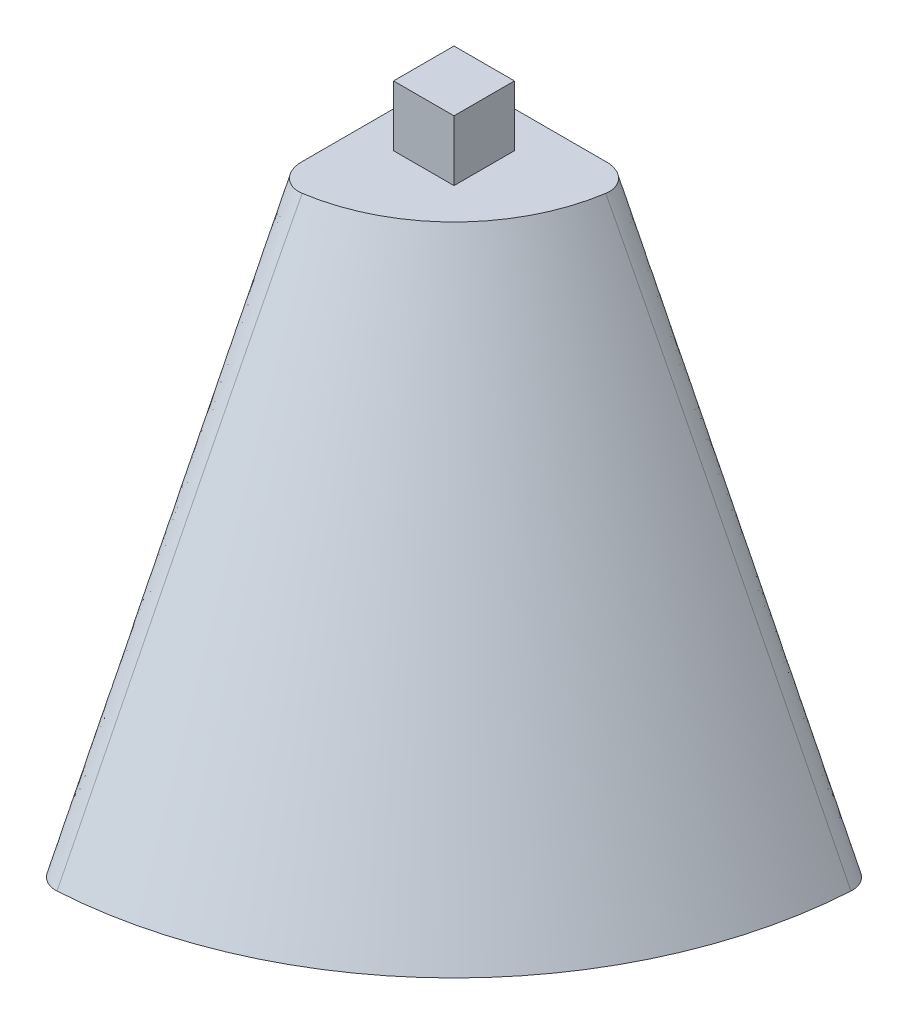
ISO-10303-21;
HEADER;
FILE_DESCRIPTION(('STEP AP214'),'2;1');
FILE_NAME('part.step','',(''),(''),'','','');
FILE_SCHEMA(('AUTOMOTIVE_DESIGN { 1 0 10303 214 1 1 1 1 }'));
ENDSEC;
DATA;
#1=APPLICATION_CONTEXT('core data for automotive mechanical design processes');
#2=APPLICATION_PROTOCOL_DEFINITION('international standard','automotive_design',2000,#1);
#3=PRODUCT_CONTEXT('',#1,'mechanical');
#4=PRODUCT('Part','Part','',(#3));
#5=PRODUCT_RELATED_PRODUCT_CATEGORY('part','',(#4));
#6=PRODUCT_DEFINITION_FORMATION('','',#4);
#7=PRODUCT_DEFINITION_CONTEXT('part definition',#1,'design');
#8=PRODUCT_DEFINITION('design','',#6,#7);
#9=PRODUCT_DEFINITION_SHAPE('','',#8);
#10=(LENGTH_UNIT() NAMED_UNIT(*) SI_UNIT(.MILLI.,.METRE.));
#11=(NAMED_UNIT(*) PLANE_ANGLE_UNIT() SI_UNIT($,.RADIAN.));
#12=(NAMED_UNIT(*) SI_UNIT($,.STERADIAN.) SOLID_ANGLE_UNIT());
#13=UNCERTAINTY_MEASURE_WITH_UNIT(LENGTH_MEASURE(1.E-05),#10,'distance_accuracy_value','');
#14=(GEOMETRIC_REPRESENTATION_CONTEXT(3) GLOBAL_UNCERTAINTY_ASSIGNED_CONTEXT((#13)) GLOBAL_UNIT_ASSIGNED_CONTEXT((#10,
#11,#12)) REPRESENTATION_CONTEXT('',''));
#15=CARTESIAN_POINT('',(0.,0.,0.));
#16=DIRECTION('',(0.,0.,1.));
#17=DIRECTION('',(1.,0.,0.));
#18=AXIS2_PLACEMENT_3D('',#15,#16,#17);
#19=CARTESIAN_POINT('',(0.,0.,0.));
#20=DIRECTION('',(0.,-1.,0.));
#21=DIRECTION('',(1.,0.,0.));
#22=AXIS2_PLACEMENT_3D('',#19,#20,#21);
#23=PLANE('',#22);
#24=DIRECTION('',(-1.,0.,0.));
#25=VECTOR('',#24,1.);
#26=CARTESIAN_POINT('',(0.,0.,0.));
#27=LINE('',#26,#25);
#28=CARTESIAN_POINT('',(12.6062667223491,0.,0.));
#29=VERTEX_POINT('',#28);
#30=CARTESIAN_POINT('',(2.99999999999999,0.,0.));
#31=VERTEX_POINT('',#30);
#32=EDGE_CURVE('E137',#29,#31,#27,.T.);
#33=ORIENTED_EDGE('',*,*,#32,.T.);
#34=CARTESIAN_POINT('',(2.99999999999999,0.,3.));
#35=DIRECTION('',(0.,-1.,0.));
#36=DIRECTION('',(1.,0.,0.));
#37=AXIS2_PLACEMENT_3D('',#34,#35,#36);
#38=CIRCLE('',#37,3.);
#39=CARTESIAN_POINT('',(0.,0.,2.99999999999999));
#40=VERTEX_POINT('',#39);
#41=EDGE_CURVE('E11',#31,#40,#38,.F.);
#42=ORIENTED_EDGE('',*,*,#41,.T.);
#43=DIRECTION('',(0.,0.,-1.));
#44=VECTOR('',#43,1.);
#45=CARTESIAN_POINT('',(0.,0.,0.));
#46=LINE('',#45,#44);
#47=CARTESIAN_POINT('',(0.,0.,12.6062667223491));
#48=VERTEX_POINT('',#47);
#49=EDGE_CURVE('E147',#48,#40,#46,.T.);
#50=ORIENTED_EDGE('',*,*,#49,.F.);
#51=CARTESIAN_POINT('',(2.09520745404908,-48.7337729551609,39.311090759011));
#52=CARTESIAN_POINT('',(-1.31838984174237E-13,-48.6890667030976,39.4003765364552));
#53=CARTESIAN_POINT('',(-1.2490009027033E-13,-49.6282001461608,37.5247717671472));
#54=CARTESIAN_POINT('',(2.09825591558037,-46.3417771603627,38.1132208088973));
#55=CARTESIAN_POINT('',(-1.27799781086608E-13,-46.2940221477129,38.2047315466528));
#56=CARTESIAN_POINT('',(-1.20993474101923E-13,-47.2362043513594,36.327065991603));
#57=CARTESIAN_POINT('',(2.10155900072438,-43.9498385284172,36.915218543094));
#58=CARTESIAN_POINT('',(-1.23962242701282E-13,-43.8997551119547,37.0096378323661));
#59=CARTESIAN_POINT('',(-1.17092090877627E-13,-44.8442657194151,35.1292460119136));
#60=CARTESIAN_POINT('',(2.10895550331378,-39.1661402113831,34.5187888362615));
#61=CARTESIAN_POINT('',(-1.1628947277766E-13,-39.1121766733257,34.6204434815684));
#62=CARTESIAN_POINT('',(-1.09289324426768E-13,-40.060567402384,32.7332513725554));
#63=CARTESIAN_POINT('',(2.11304892041693,-36.7743805262175,33.3203613954164));
#64=CARTESIAN_POINT('',(-1.12452619414258E-13,-36.7178523542753,33.4258383684079));
#65=CARTESIAN_POINT('',(-1.05387941200206E-13,-37.66880771722,31.5350767130405));
#66=CARTESIAN_POINT('',(2.12230716336211,-31.9911082277229,30.9229225520435));
#67=CARTESIAN_POINT('',(-1.04377895591329E-13,-31.9299143349147,31.0376939245209));
#68=CARTESIAN_POINT('',(0.,-32.8855354187203,29.1382481991043));
#69=CARTESIAN_POINT('',(2.12747198670636,-29.599595613831,29.7239111508834));
#70=CARTESIAN_POINT('',(-1.00136698595859E-13,-29.5349156454655,29.8434655363361));
#71=CARTESIAN_POINT('',(0.,-30.4940228048216,27.9395943458067));
#72=CARTESIAN_POINT('',(2.13936911123669,-24.8169234930147,27.3250067019271));
#73=CARTESIAN_POINT('',(0.,-24.74610791853,27.4566665490894));
#74=CARTESIAN_POINT('',(0.,-25.7113506840199,25.5415797061697));
#75=CARTESIAN_POINT('',(2.14610141312043,-22.4257639862481,26.1251136537386));
#76=CARTESIAN_POINT('',(0.,-22.3502499820417,26.2630781598969));
#77=CARTESIAN_POINT('',(0.,-23.3201911772746,24.3422189195158));
#78=CARTESIAN_POINT('',(2.16194227677236,-17.643973973532,23.7239472541923));
#79=CARTESIAN_POINT('',(0.,-17.5599563428948,23.8782696667915));
#80=CARTESIAN_POINT('',(0.,-18.5384011645053,21.9424193023201));
#81=CARTESIAN_POINT('',(2.17105084796585,-15.2533434697184,22.5226738973785));
#82=CARTESIAN_POINT('',(0.,-15.1623690938531,22.6854877539769));
#83=CARTESIAN_POINT('',(0.,-16.1477706606172,20.741980467521));
#84=CARTESIAN_POINT('',(2.18768322034261,-11.6680760449612,20.7189656325648));
#85=CARTESIAN_POINT('',(0.,-11.5736659745978,20.9022913868091));
#86=CARTESIAN_POINT('',(0.,-12.5625032359048,18.9399759064426));
#87=CARTESIAN_POINT('',(2.19372225946164,-10.4731006366861,20.1174301813409));
#88=CARTESIAN_POINT('',(0.,-10.3749742517414,20.3070349645445));
#89=CARTESIAN_POINT('',(0.,-11.3675278276708,18.3390836760893));
#90=CARTESIAN_POINT('',(2.20713507743186,-8.08345509614255,18.9135263384728));
#91=CARTESIAN_POINT('',(0.,-7.97787992133957,19.1176665028858));
#92=CARTESIAN_POINT('',(0.,-8.97788228715727,17.1366916394181));
#93=CARTESIAN_POINT('',(2.21450885662903,-6.88878496395324,18.3111579466127));
#94=CARTESIAN_POINT('',(0.,-6.77856156171675,18.5231038389545));
#95=CARTESIAN_POINT('',(0.,-7.78321215495696,16.5351918329428));
#96=CARTESIAN_POINT('',(2.23108093024212,-4.49985997475611,17.1052420397375));
#97=CARTESIAN_POINT('',(0.,-4.38023713478147,17.3355460835015));
#98=CARTESIAN_POINT('',(0.,-5.39428716575221,15.3313560801745));
#99=CARTESIAN_POINT('',(2.24027923199876,-3.30560511943847,16.501694519988));
#100=CARTESIAN_POINT('',(0.,-3.17995746875332,16.7419269810444));
#101=CARTESIAN_POINT('',(0.,-4.20003231043795,14.7290201305272));
#102=CARTESIAN_POINT('',(2.26125803845047,-0.917695092815208,15.2928684545352));
#103=CARTESIAN_POINT('',(0.,-0.779697479551548,15.556916481961));
#104=CARTESIAN_POINT('',(0.,-1.81212228379557,13.5231622368254));
#105=CARTESIAN_POINT('',(2.2730385413027,0.275960078917779,14.6875899100677));
#106=CARTESIAN_POINT('',(0.,0.422125340826944,14.9646279931276));
#107=CARTESIAN_POINT('',(0.,-0.618467112040083,12.9196402936177));
#108=CARTESIAN_POINT('',(2.29361221440765,2.06576380780487,13.7776179514834));
#109=CARTESIAN_POINT('',(0.,2.22083827894981,14.0806357624269));
#110=CARTESIAN_POINT('',(0.,1.17133661678393,12.0130107040506));
#111=CARTESIAN_POINT('',(2.30095394326552,2.66225310090716,13.4739509839486));
#112=CARTESIAN_POINT('',(0.,2.82207087808302,13.7855705439965));
#113=CARTESIAN_POINT('',(0.,1.76782590984905,11.7105757739588));
#114=CARTESIAN_POINT('',(2.3168592304806,3.85494217986451,12.865722545751));
#115=CARTESIAN_POINT('',(0.,4.0247165035559,13.1964284649654));
#116=CARTESIAN_POINT('',(0.,2.96051498892362,11.1051359394984));
#117=CARTESIAN_POINT('',(2.32542278849665,4.45114196580037,12.561161075338));
#118=CARTESIAN_POINT('',(0.,4.62658690170721,12.902132639026));
#119=CARTESIAN_POINT('',(0.,3.55671477501386,10.8021310352888));
#120=CARTESIAN_POINT('',(2.34408582081135,5.64317605041756,11.9508760271658));
#121=CARTESIAN_POINT('',(0.,5.83070728388637,12.3147589567844));
#122=CARTESIAN_POINT('',(0.,4.74874885965276,10.1953992432551));
#123=CARTESIAN_POINT('',(2.35418529883994,6.2390103482078,11.6451524465862));
#124=CARTESIAN_POINT('',(0.,6.43354518459165,12.0214022248107));
#125=CARTESIAN_POINT('',(0.,5.34458315731031,9.89167235367935));
#126=CARTESIAN_POINT('',(2.3764180938154,7.4301858610677,11.0320880494411));
#127=CARTESIAN_POINT('',(0.,7.63950260759333,11.4365025474042));
#128=CARTESIAN_POINT('',(0.,6.53575866997604,9.28325195409953));
#129=CARTESIAN_POINT('',(2.38855141272532,8.02552707566088,10.7247472313149));
#130=CARTESIAN_POINT('',(0.,8.2434228792103,11.1445845939435));
#131=CARTESIAN_POINT('',(0.,7.13109988450773,8.97855844316275));
#132=CARTESIAN_POINT('',(2.40195061196753,8.62055810024721,10.4163701568202));
#133=CARTESIAN_POINT('',(0.,8.84552959329068,10.8548074850276));
#134=CARTESIAN_POINT('',(0.,7.7261309092473,8.67325922932912));
#135=(BOUNDED_SURFACE() B_SPLINE_SURFACE(3,2,((#51,#52,#53),(#54,#55,#56),(#57,#58,#59),(#60,
#61,#62),(#63,#64,#65),(#66,#67,#68),(#69,#70,#71),(#72,#73,#74),(#75,#76,#77),(#78,#79,#80),
(#81,#82,#83),(#84,#85,#86),(#87,#88,#89),(#90,#91,#92),(#93,#94,#95),(#96,#97,#98),(#99,#100,
#101),(#102,#103,#104),(#105,#106,#107),(#108,#109,#110),(#111,#112,#113),(#114,#115,#116),
(#117,#118,#119),(#120,#121,#122),(#123,#124,#125),(#126,#127,#128),(#129,#130,#131),(#132,#133,
#134)),.UNSPECIFIED.,.F.,.F.,.F.) B_SPLINE_SURFACE_WITH_KNOTS((4,2,2,2,2,2,2,2,2,2,2,2,2,4),(3,
3),(0.,8.02529049000333,16.0505775048038,24.0758458104915,32.1011176881559,40.1264213979952,
44.1390686972588,48.1517170366414,52.1643815207037,56.1770431410619,58.183382173781,
60.1897206462869,62.1960639911929,64.2024092726133),(0.,1.),
.UNSPECIFIED.) GEOMETRIC_REPRESENTATION_ITEM() RATIONAL_B_SPLINE_SURFACE(((1.,0.690071109732684,
1.),(1.,0.689518761389713,1.),(1.,0.688919913212359,1.),(1.,0.687576635268854,1.),(1.,
0.686832205565745,1.),(1.,0.68514518422986,1.),(1.,0.684202593059057,1.),(1.,0.682025591040535,
1.),(1.,0.68079118006293,1.),(1.,0.677876606798386,1.),(1.,0.676196442743398,1.),(1.,
0.67311231969768,1.),(1.,0.671990299985542,1.),(1.,0.669490721703977,1.),(1.,0.66811316306831,
1.),(1.,0.665005401262852,1.),(1.,0.663275196674236,1.),(1.,0.659309910142084,1.),(1.,
0.657074828558863,1.),(1.,0.653145168382874,1.),(1.,0.65173910521825,1.),(1.,0.648681370292172,
1.),(1.,0.647029698599296,1.),(1.,0.643414292925601,1.),(1.,0.641450558186948,1.),(1.,
0.637102649023961,1.),(1.,0.634718474193824,1.),(1.,0.632069890920385,1.))) REPRESENTATION_ITEM('') SURFACE());
#136=CARTESIAN_POINT('',(0.,0.,12.6062667223491));
#137=CARTESIAN_POINT('',(-3.7695313581294E-05,0.,12.7443059321442));
#138=CARTESIAN_POINT('',(0.0113764687085337,0.,12.8824119721706));
#139=CARTESIAN_POINT('',(0.0569516477288433,0.,13.1552526066186));
#140=CARTESIAN_POINT('',(0.0911838863235445,0.,13.2899752696612));
#141=CARTESIAN_POINT('',(0.182314281030711,0.,13.5518538960482));
#142=CARTESIAN_POINT('',(0.239251340873883,0.,13.6789964391162));
#143=CARTESIAN_POINT('',(0.375063214180196,0.,13.9208917651224));
#144=CARTESIAN_POINT('',(0.453912456616013,0.,14.0356587746466));
#145=CARTESIAN_POINT('',(0.626295144810635,0.,14.2411043321281));
#146=CARTESIAN_POINT('',(0.718530812335812,0.,14.3328674541473));
#147=CARTESIAN_POINT('',(0.918832774807159,0.,14.4971503201449));
#148=CARTESIAN_POINT('',(1.02688664557578,0.,14.5696850422482));
#149=CARTESIAN_POINT('',(1.24234282992077,0.,14.6845112998261));
#150=CARTESIAN_POINT('',(1.3484104807182,0.,14.7293105620108));
#151=CARTESIAN_POINT('',(1.56702578770132,0.,14.798297294914));
#152=CARTESIAN_POINT('',(1.67956591543736,0.,14.8225082152215));
#153=CARTESIAN_POINT('',(1.87262805104914,0.,14.8449985173681));
#154=CARTESIAN_POINT('',(1.95253636440365,0.,14.848907067729));
#155=CARTESIAN_POINT('',(2.11215798276701,0.,14.8460350376201));
#156=CARTESIAN_POINT('',(2.19187129162923,0.,14.8392546701046));
#157=CARTESIAN_POINT('',(2.27080988034257,0.,14.8271178078323));
#158=B_SPLINE_CURVE_WITH_KNOTS('',3,(#136,#137,#138,#139,#140,#141,#142,#143,#144,#145,#146,
#147,#148,#149,#150,#151,#152,#153,#154,#155,#156,#157),.UNSPECIFIED.,.F.,.F.,(4,2,2,2,2,2,2,2,
2,2,4),(0.,0.413761899998252,0.828821388780443,1.24459514113895,1.65988571770159,
2.0480132917747,2.43583763623167,2.77937452390945,3.12251960587338,3.36185330529924,
3.60118223655885),.UNSPECIFIED.);
#159=CARTESIAN_POINT('',(2.27080988034258,0.,14.8271178078323));
#160=VERTEX_POINT('',#159);
#161=EDGE_CURVE('E165',#48,#160,#158,.T.);
#162=ORIENTED_EDGE('',*,*,#161,.T.);
#163=CARTESIAN_POINT('',(0.,0.,0.));
#164=DIRECTION('',(0.,1.,0.));
#165=DIRECTION('',(-1.,0.,0.));
#166=AXIS2_PLACEMENT_3D('',#163,#164,#165);
#167=CIRCLE('',#166,15.);
#168=CARTESIAN_POINT('',(14.8271178078323,0.,2.27080988034263));
#169=VERTEX_POINT('',#168);
#170=EDGE_CURVE('E150',#160,#169,#167,.T.);
#171=ORIENTED_EDGE('',*,*,#170,.T.);
#172=CARTESIAN_POINT('',(37.5247717671472,-49.6282001461608,0.));
#173=CARTESIAN_POINT('',(39.4003765364552,-48.6890667030976,0.));
#174=CARTESIAN_POINT('',(39.311090759011,-48.7337729551608,2.09520745404921));
#175=CARTESIAN_POINT('',(36.327065991603,-47.2362043513594,0.));
#176=CARTESIAN_POINT('',(38.2047315466528,-46.2940221477129,0.));
#177=CARTESIAN_POINT('',(38.1132208088972,-46.3417771603627,2.0982559155805));
#178=CARTESIAN_POINT('',(35.1292460119136,-44.8442657194151,0.));
#179=CARTESIAN_POINT('',(37.0096378323661,-43.8997551119547,0.));
#180=CARTESIAN_POINT('',(36.915218543094,-43.9498385284172,2.1015590007245));
#181=CARTESIAN_POINT('',(32.7332513725554,-40.0605674023839,0.));
#182=CARTESIAN_POINT('',(34.6204434815684,-39.1121766733257,0.));
#183=CARTESIAN_POINT('',(34.5187888362615,-39.1661402113831,2.1089555033139));
#184=CARTESIAN_POINT('',(31.5350767130405,-37.66880771722,0.));
#185=CARTESIAN_POINT('',(33.4258383684079,-36.7178523542753,0.));
#186=CARTESIAN_POINT('',(33.3203613954164,-36.7743805262175,2.11304892041704));
#187=CARTESIAN_POINT('',(29.1382481991043,-32.8855354187203,0.));
#188=CARTESIAN_POINT('',(31.0376939245209,-31.9299143349147,0.));
#189=CARTESIAN_POINT('',(30.9229225520435,-31.9911082277229,2.12230716336221));
#190=CARTESIAN_POINT('',(27.9395943458067,-30.4940228048216,0.));
#191=CARTESIAN_POINT('',(29.8434655363361,-29.5349156454654,0.));
#192=CARTESIAN_POINT('',(29.7239111508834,-29.599595613831,2.12747198670646));
#193=CARTESIAN_POINT('',(25.5415797061697,-25.7113506840199,0.));
#194=CARTESIAN_POINT('',(27.4566665490894,-24.74610791853,0.));
#195=CARTESIAN_POINT('',(27.325006701927,-24.8169234930147,2.13936911123678));
#196=CARTESIAN_POINT('',(24.3422189195158,-23.3201911772746,0.));
#197=CARTESIAN_POINT('',(26.2630781598969,-22.3502499820417,0.));
#198=CARTESIAN_POINT('',(26.1251136537386,-22.4257639862481,2.14610141312052));
#199=CARTESIAN_POINT('',(21.9424193023201,-18.5384011645053,0.));
#200=CARTESIAN_POINT('',(23.8782696667915,-17.5599563428947,0.));
#201=CARTESIAN_POINT('',(23.7239472541923,-17.6439739735319,2.16194227677244));
#202=CARTESIAN_POINT('',(20.741980467521,-16.1477706606172,0.));
#203=CARTESIAN_POINT('',(22.6854877539769,-15.1623690938531,0.));
#204=CARTESIAN_POINT('',(22.5226738973785,-15.2533434697184,2.17105084796593));
#205=CARTESIAN_POINT('',(18.9399759064426,-12.5625032359048,0.));
#206=CARTESIAN_POINT('',(20.9022913868091,-11.5736659745978,0.));
#207=CARTESIAN_POINT('',(20.7189656325648,-11.6680760449612,2.18768322034268));
#208=CARTESIAN_POINT('',(18.3390836760893,-11.3675278276708,0.));
#209=CARTESIAN_POINT('',(20.3070349645445,-10.3749742517414,0.));
#210=CARTESIAN_POINT('',(20.1174301813409,-10.4731006366861,2.1937222594617));
#211=CARTESIAN_POINT('',(17.1366916394181,-8.97788228715726,0.));
#212=CARTESIAN_POINT('',(19.1176665028858,-7.97787992133956,0.));
#213=CARTESIAN_POINT('',(18.9135263384728,-8.08345509614255,2.20713507743192));
#214=CARTESIAN_POINT('',(16.5351918329428,-7.78321215495695,0.));
#215=CARTESIAN_POINT('',(18.5231038389545,-6.77856156171673,0.));
#216=CARTESIAN_POINT('',(18.3111579466127,-6.88878496395323,2.21450885662909));
#217=CARTESIAN_POINT('',(15.3313560801745,-5.3942871657522,0.));
#218=CARTESIAN_POINT('',(17.3355460835015,-4.38023713478145,0.));
#219=CARTESIAN_POINT('',(17.1052420397375,-4.4998599747561,2.23108093024217));
#220=CARTESIAN_POINT('',(14.7290201305271,-4.20003231043794,0.));
#221=CARTESIAN_POINT('',(16.7419269810444,-3.17995746875331,0.));
#222=CARTESIAN_POINT('',(16.501694519988,-3.30560511943846,2.24027923199881));
#223=CARTESIAN_POINT('',(13.5231622368254,-1.81212228379556,0.));
#224=CARTESIAN_POINT('',(15.556916481961,-0.779697479551542,0.));
#225=CARTESIAN_POINT('',(15.2928684545352,-0.917695092815199,2.26125803845052));
#226=CARTESIAN_POINT('',(12.9196402936177,-0.618467112040077,0.));
#227=CARTESIAN_POINT('',(14.9646279931276,0.422125340826951,0.));
#228=CARTESIAN_POINT('',(14.6875899100677,0.275960078917786,2.27303854130275));
#229=CARTESIAN_POINT('',(12.0130107040506,1.17133661678393,0.));
#230=CARTESIAN_POINT('',(14.0806357624269,2.22083827894981,0.));
#231=CARTESIAN_POINT('',(13.7776179514834,2.06576380780488,2.29361221440769));
#232=CARTESIAN_POINT('',(11.7105757739588,1.76782590984906,0.));
#233=CARTESIAN_POINT('',(13.7855705439965,2.82207087808303,0.));
#234=CARTESIAN_POINT('',(13.4739509839485,2.66225310090717,2.30095394326557));
#235=CARTESIAN_POINT('',(11.1051359394984,2.96051498892363,0.));
#236=CARTESIAN_POINT('',(13.1964284649653,4.02471650355591,0.));
#237=CARTESIAN_POINT('',(12.865722545751,3.85494217986452,2.31685923048065));
#238=CARTESIAN_POINT('',(10.8021310352888,3.55671477501387,0.));
#239=CARTESIAN_POINT('',(12.902132639026,4.62658690170722,0.));
#240=CARTESIAN_POINT('',(12.561161075338,4.45114196580038,2.32542278849669));
#241=CARTESIAN_POINT('',(10.1953992432551,4.74874885965277,0.));
#242=CARTESIAN_POINT('',(12.3147589567844,5.83070728388638,0.));
#243=CARTESIAN_POINT('',(11.9508760271658,5.64317605041757,2.34408582081139));
#244=CARTESIAN_POINT('',(9.89167235367935,5.34458315731032,0.));
#245=CARTESIAN_POINT('',(12.0214022248107,6.43354518459166,0.));
#246=CARTESIAN_POINT('',(11.6451524465862,6.23901034820781,2.35418529883998));
#247=CARTESIAN_POINT('',(9.28325195409954,6.53575866997604,0.));
#248=CARTESIAN_POINT('',(11.4365025474042,7.63950260759333,0.));
#249=CARTESIAN_POINT('',(11.0320880494411,7.4301858610677,2.37641809381544));
#250=CARTESIAN_POINT('',(8.97855844316276,7.13109988450773,0.));
#251=CARTESIAN_POINT('',(11.1445845939435,8.24342287921031,0.));
#252=CARTESIAN_POINT('',(10.7247472313149,8.02552707566087,2.38855141272536));
#253=CARTESIAN_POINT('',(8.67325922932911,7.7261309092473,0.));
#254=CARTESIAN_POINT('',(10.8548074850276,8.84552959329068,0.));
#255=CARTESIAN_POINT('',(10.4163701568202,8.62055810024722,2.40195061196757));
#256=(BOUNDED_SURFACE() B_SPLINE_SURFACE(3,2,((#172,#173,#174),(#175,#176,#177),(#178,#179,
#180),(#181,#182,#183),(#184,#185,#186),(#187,#188,#189),(#190,#191,#192),(#193,#194,#195),
(#196,#197,#198),(#199,#200,#201),(#202,#203,#204),(#205,#206,#207),(#208,#209,#210),(#211,#212,
#213),(#214,#215,#216),(#217,#218,#219),(#220,#221,#222),(#223,#224,#225),(#226,#227,#228),
(#229,#230,#231),(#232,#233,#234),(#235,#236,#237),(#238,#239,#240),(#241,#242,#243),(#244,#245,
#246),(#247,#248,#249),(#250,#251,#252),(#253,#254,#255)),.UNSPECIFIED.,.F.,.F.,
.F.) B_SPLINE_SURFACE_WITH_KNOTS((4,2,2,2,2,2,2,2,2,2,2,2,2,4),(3,3),(0.,8.02529049000333,
16.0505775048038,24.0758458104915,32.1011176881559,40.1264213979952,44.1390686972588,
48.1517170366414,52.1643815207037,56.1770431410619,58.183382173781,60.1897206462869,
62.1960639911929,64.2024092726133),(0.,1.),
.UNSPECIFIED.) GEOMETRIC_REPRESENTATION_ITEM() RATIONAL_B_SPLINE_SURFACE(((1.,0.690071109732684,
1.),(1.,0.689518761389713,1.),(1.,0.688919913212359,1.),(1.,0.687576635268854,1.),(1.,
0.686832205565745,1.),(1.,0.68514518422986,1.),(1.,0.684202593059057,1.),(1.,0.682025591040535,
1.),(1.,0.68079118006293,1.),(1.,0.677876606798386,1.),(1.,0.676196442743398,1.),(1.,
0.67311231969768,1.),(1.,0.671990299985542,1.),(1.,0.669490721703976,1.),(1.,0.66811316306831,
1.),(1.,0.665005401262852,1.),(1.,0.663275196674236,1.),(1.,0.659309910142084,1.),(1.,
0.657074828558863,1.),(1.,0.653145168382874,1.),(1.,0.65173910521825,1.),(1.,0.648681370292172,
1.),(1.,0.647029698599296,1.),(1.,0.643414292925601,1.),(1.,0.641450558186948,1.),(1.,
0.637102649023961,1.),(1.,0.634718474193823,1.),(1.,0.632069890920385,1.))) REPRESENTATION_ITEM('') SURFACE());
#257=CARTESIAN_POINT('',(14.8271178078323,0.,2.27080988034263));
#258=CARTESIAN_POINT('',(14.8348448556579,0.,2.22043504955516));
#259=CARTESIAN_POINT('',(14.8404099709736,0.,2.16973036171023));
#260=CARTESIAN_POINT('',(14.8471921926699,0.,2.06803683209176));
#261=CARTESIAN_POINT('',(14.8484097958036,0.,2.01704802344913));
#262=CARTESIAN_POINT('',(14.8464771890729,0.,1.91528509794252));
#263=CARTESIAN_POINT('',(14.8433385412512,0.,1.86451077016193));
#264=CARTESIAN_POINT('',(14.8327562552764,0.,1.76342722730717));
#265=CARTESIAN_POINT('',(14.8253126608871,0.,1.71311800751002));
#266=CARTESIAN_POINT('',(14.796635155401,0.,1.56340623759012));
#267=CARTESIAN_POINT('',(14.7690529548527,0.,1.46514533832453));
#268=CARTESIAN_POINT('',(14.6981563370804,0.,1.27454272022102));
#269=CARTESIAN_POINT('',(14.6548379002969,0.,1.18220252082364));
#270=CARTESIAN_POINT('',(14.5530150343261,0.,1.0034343202628));
#271=CARTESIAN_POINT('',(14.4941770901158,0.,0.91719669276937));
#272=CARTESIAN_POINT('',(14.3639447308803,0.,0.754813325759873));
#273=CARTESIAN_POINT('',(14.2925457472524,0.,0.678671275858887));
#274=CARTESIAN_POINT('',(14.1326705670793,0.,0.53146773965512));
#275=CARTESIAN_POINT('',(14.043245710493,0.,0.461438011455531));
#276=CARTESIAN_POINT('',(13.8548492863791,0.,0.335668062354338));
#277=CARTESIAN_POINT('',(13.7558722553251,0.,0.279936086754386));
#278=CARTESIAN_POINT('',(13.539917070008,0.,0.178134644277968));
#279=CARTESIAN_POINT('',(13.4221474202701,0.,0.133746772655893));
#280=CARTESIAN_POINT('',(13.1812412234998,0.,0.0636098475447384));
#281=CARTESIAN_POINT('',(13.0581077003975,0.,0.0378504326649724));
#282=CARTESIAN_POINT('',(12.8794983142969,0.,0.0143056935537875));
#283=CARTESIAN_POINT('',(12.8249288249768,0.,0.00893543419943216));
#284=CARTESIAN_POINT('',(12.7156682576996,0.,0.00178745824198452));
#285=CARTESIAN_POINT('',(12.6609776648334,0.,2.33242872587098E-06));
#286=CARTESIAN_POINT('',(12.6062667223491,0.,0.));
#287=B_SPLINE_CURVE_WITH_KNOTS('',3,(#257,#258,#259,#260,#261,#262,#263,#264,#265,#266,#267,
#268,#269,#270,#271,#272,#273,#274,#275,#276,#277,#278,#279,#280,#281,#282,#283,#284,#285,#286),
.UNSPECIFIED.,.F.,.F.,(4,2,2,2,2,2,2,2,2,2,2,2,2,2,4),(0.,0.15284245630311,0.305667448043033,
0.458087597611125,0.610506197706583,0.915123479696763,1.2198186258703,1.53168724317837,
1.84366952628928,2.18302216641078,2.52257006846741,2.89860090236022,3.27442242179307,
3.43882529357571,3.60288805136448),.UNSPECIFIED.);
#288=EDGE_CURVE('E261',#169,#29,#287,.T.);
#289=ORIENTED_EDGE('',*,*,#288,.T.);
#290=EDGE_LOOP('',(#33,#42,#50,#162,#171,#289));
#291=FACE_BOUND('',#290,.T.);
#292=DIRECTION('',(0.,0.,1.));
#293=VECTOR('',#292,1.);
#294=CARTESIAN_POINT('',(2.99999999999999,0.,3.));
#295=LINE('',#294,#293);
#296=CARTESIAN_POINT('',(2.99999999999999,0.,3.));
#297=VERTEX_POINT('',#296);
#298=CARTESIAN_POINT('',(3.,0.,8.));
#299=VERTEX_POINT('',#298);
#300=EDGE_CURVE('E54',#297,#299,#295,.T.);
#301=ORIENTED_EDGE('',*,*,#300,.F.);
#302=DIRECTION('',(-1.,0.,0.));
#303=VECTOR('',#302,1.);
#304=CARTESIAN_POINT('',(2.99999999999999,0.,3.));
#305=LINE('',#304,#303);
#306=CARTESIAN_POINT('',(7.99999999999999,0.,3.));
#307=VERTEX_POINT('',#306);
#308=EDGE_CURVE('E58',#307,#297,#305,.T.);
#309=ORIENTED_EDGE('',*,*,#308,.F.);
#310=DIRECTION('',(0.,0.,-1.));
#311=VECTOR('',#310,1.);
#312=CARTESIAN_POINT('',(7.99999999999999,0.,3.));
#313=LINE('',#312,#311);
#314=CARTESIAN_POINT('',(8.,0.,8.));
#315=VERTEX_POINT('',#314);
#316=EDGE_CURVE('E350',#315,#307,#313,.T.);
#317=ORIENTED_EDGE('',*,*,#316,.F.);
#318=DIRECTION('',(1.,0.,0.));
#319=VECTOR('',#318,1.);
#320=CARTESIAN_POINT('',(3.,0.,8.));
#321=LINE('',#320,#319);
#322=EDGE_CURVE('E356',#299,#315,#321,.T.);
#323=ORIENTED_EDGE('',*,*,#322,.F.);
#324=EDGE_LOOP('',(#301,#309,#317,#323));
#325=FACE_BOUND('',#324,.T.);
#326=ADVANCED_FACE('F39',(#291,#325),#23,.F.);
#327=CARTESIAN_POINT('',(0.,-40.,0.));
#328=DIRECTION('',(0.,1.,0.));
#329=DIRECTION('',(-1.,0.,0.));
#330=AXIS2_PLACEMENT_3D('',#327,#328,#329);
#331=PLANE('',#330);
#332=DIRECTION('',(0.,0.,1.));
#333=VECTOR('',#332,1.);
#334=CARTESIAN_POINT('',(0.,-40.,0.));
#335=LINE('',#334,#333);
#336=CARTESIAN_POINT('',(0.,-40.,2.99999999999999));
#337=VERTEX_POINT('',#336);
#338=CARTESIAN_POINT('',(-1.09282741566664E-13,-40.,32.7028323173241));
#339=VERTEX_POINT('',#338);
#340=EDGE_CURVE('E145',#337,#339,#335,.T.);
#341=ORIENTED_EDGE('',*,*,#340,.F.);
#342=CARTESIAN_POINT('',(2.99999999999999,-40.,3.));
#343=DIRECTION('',(0.,1.,0.));
#344=DIRECTION('',(-1.,0.,0.));
#345=AXIS2_PLACEMENT_3D('',#342,#343,#344);
#346=CIRCLE('',#345,3.);
#347=CARTESIAN_POINT('',(2.99999999999999,-40.,0.));
#348=VERTEX_POINT('',#347);
#349=EDGE_CURVE('E250',#337,#348,#346,.F.);
#350=ORIENTED_EDGE('',*,*,#349,.T.);
#351=DIRECTION('',(1.,0.,0.));
#352=VECTOR('',#351,1.);
#353=CARTESIAN_POINT('',(0.,-40.,0.));
#354=LINE('',#353,#352);
#355=CARTESIAN_POINT('',(32.7028323173241,-40.,0.));
#356=VERTEX_POINT('',#355);
#357=EDGE_CURVE('E135',#348,#356,#354,.T.);
#358=ORIENTED_EDGE('',*,*,#357,.T.);
#359=CARTESIAN_POINT('',(32.7028323173241,-40.,0.));
#360=CARTESIAN_POINT('',(32.8403368914541,-40.,-3.86559565033637E-05));
#361=CARTESIAN_POINT('',(32.9779059547685,-40.,0.0113369890377057));
#362=CARTESIAN_POINT('',(33.2496812223575,-40.,0.0567471566380406));
#363=CARTESIAN_POINT('',(33.3838756403478,-40.,0.0908520233928251));
#364=CARTESIAN_POINT('',(33.6447268574624,-40.,0.181625280088148));
#365=CARTESIAN_POINT('',(33.7713704876379,-40.,0.238331837271866));
#366=CARTESIAN_POINT('',(34.0123347312404,-40.,0.373555343925404));
#367=CARTESIAN_POINT('',(34.126670130559,-40.,0.452045709361273));
#368=CARTESIAN_POINT('',(34.3315638312657,-40.,0.62373733118686));
#369=CARTESIAN_POINT('',(34.4231748842917,-40.,0.715677392389101));
#370=CARTESIAN_POINT('',(34.5872914783602,-40.,0.915350817463398));
#371=CARTESIAN_POINT('',(34.6598069862082,-40.,1.02307589655646));
#372=CARTESIAN_POINT('',(34.7748820889214,-40.,1.23814525860832));
#373=CARTESIAN_POINT('',(34.8198844836285,-40.,1.34418543021922));
#374=CARTESIAN_POINT('',(34.8892858887834,-40.,1.56273547577654));
#375=CARTESIAN_POINT('',(34.9137224570646,-40.,1.67523315359062));
#376=CARTESIAN_POINT('',(34.9335161952698,-40.,1.84179971582883));
#377=CARTESIAN_POINT('',(34.9374346140837,-40.,1.89496765892183));
#378=CARTESIAN_POINT('',(34.9405160328549,-40.,2.00136966543985));
#379=CARTESIAN_POINT('',(34.9396854105877,-40.,2.05460354424312));
#380=CARTESIAN_POINT('',(34.9364779347904,-40.,2.1077261472745));
#381=B_SPLINE_CURVE_WITH_KNOTS('',3,(#359,#360,#361,#362,#363,#364,#365,#366,#367,#368,#369,
#370,#371,#372,#373,#374,#375,#376,#377,#378,#379,#380),.UNSPECIFIED.,.F.,.F.,(4,2,2,2,2,2,2,2,
2,2,4),(0.,0.412155680831044,0.825592893329146,1.23973125127795,1.65336641799501,
2.04055898699111,2.42754906076953,2.77127033489148,3.11436252594842,3.27411833125718,
3.43365964123898),.UNSPECIFIED.);
#382=CARTESIAN_POINT('',(34.9364779347904,-40.,2.1077261472745));
#383=VERTEX_POINT('',#382);
#384=EDGE_CURVE('E240',#356,#383,#381,.T.);
#385=ORIENTED_EDGE('',*,*,#384,.T.);
#386=CARTESIAN_POINT('',(0.,-40.,0.));
#387=DIRECTION('',(0.,1.,0.));
#388=DIRECTION('',(-1.,0.,0.));
#389=AXIS2_PLACEMENT_3D('',#386,#387,#388);
#390=CIRCLE('',#389,35.);
#391=CARTESIAN_POINT('',(2.10772614727439,-40.,34.9364779347904));
#392=VERTEX_POINT('',#391);
#393=EDGE_CURVE('E153',#392,#383,#390,.T.);
#394=ORIENTED_EDGE('',*,*,#393,.F.);
#395=CARTESIAN_POINT('',(2.10772614727439,-40.,34.9364779347904));
#396=CARTESIAN_POINT('',(2.05627931348235,-40.,34.9395916782345));
#397=CARTESIAN_POINT('',(2.00470043909725,-40.,34.9404651163381));
#398=CARTESIAN_POINT('',(1.90166977939055,-40.,34.9377623458894));
#399=CARTESIAN_POINT('',(1.85021797000701,-40.,34.9341870568872));
#400=CARTESIAN_POINT('',(1.74797430091004,-40.,34.9226375007953));
#401=CARTESIAN_POINT('',(1.69718085998727,-40.,34.9146772968127));
#402=CARTESIAN_POINT('',(1.59646766000637,-40.,34.8944702216078));
#403=CARTESIAN_POINT('',(1.54654791327234,-40.,34.8822232899692));
#404=CARTESIAN_POINT('',(1.39865396563297,-40.,34.839248430485));
#405=CARTESIAN_POINT('',(1.30242170565514,-40.,34.8022721522294));
#406=CARTESIAN_POINT('',(1.11726533340172,-40.,34.713229089312));
#407=CARTESIAN_POINT('',(1.02834479876564,-40.,34.6611549729907));
#408=CARTESIAN_POINT('',(0.856733730722798,-40.,34.5418182453525));
#409=CARTESIAN_POINT('',(0.774367034012724,-40.,34.4740907473028));
#410=CARTESIAN_POINT('',(0.620953540796544,-40.,34.3268803865899));
#411=CARTESIAN_POINT('',(0.549909854772078,-40.,34.2473943053142));
#412=CARTESIAN_POINT('',(0.413911360963352,-40.,34.0709014476672));
#413=CARTESIAN_POINT('',(0.350188691326112,-40.,33.9729460566095));
#414=CARTESIAN_POINT('',(0.238270354377964,-40.,33.7684840515569));
#415=CARTESIAN_POINT('',(0.190088469845208,-40.,33.661969951019));
#416=CARTESIAN_POINT('',(0.10551587477948,-40.,33.4316189751937));
#417=CARTESIAN_POINT('',(0.0708875351434147,-40.,33.3071359453531));
#418=CARTESIAN_POINT('',(0.021494904192571,-40.,33.0544807291892));
#419=CARTESIAN_POINT('',(0.00669568647464974,-40.,32.9263154366314));
#420=CARTESIAN_POINT('',(0.000601233432340663,-40.,32.7662258085137));
#421=CARTESIAN_POINT('',(-1.467664243297E-06,-40.,32.7345233862063));
#422=CARTESIAN_POINT('',(-1.09190594226825E-13,-40.,32.7028323173241));
#423=B_SPLINE_CURVE_WITH_KNOTS('',3,(#395,#396,#397,#398,#399,#400,#401,#402,#403,#404,#405,
#406,#407,#408,#409,#410,#411,#412,#413,#414,#415,#416,#417,#418,#419,#420,#421,#422),
.UNSPECIFIED.,.F.,.F.,(4,2,2,2,2,2,2,2,2,2,2,2,2,4),(0.,0.154568834600362,0.309105725201276,
0.463149853360904,0.617196152679161,0.924920967556546,1.23279546765617,1.55136778919605,
1.87002747369987,2.21916313165258,2.56860758428479,2.95463345408089,3.33997849205786,
3.43507719346778),.UNSPECIFIED.);
#424=EDGE_CURVE('E208',#392,#339,#423,.T.);
#425=ORIENTED_EDGE('',*,*,#424,.T.);
#426=EDGE_LOOP('',(#341,#350,#358,#385,#394,#425));
#427=FACE_BOUND('',#426,.T.);
#428=ADVANCED_FACE('F266',(#427),#331,.F.);
#429=CARTESIAN_POINT('',(0.,-40.,0.));
#430=DIRECTION('',(0.,-1.,0.));
#431=DIRECTION('',(1.,0.,0.));
#432=AXIS2_PLACEMENT_3D('',#429,#430,#431);
#433=CONICAL_SURFACE('',#432,35.,0.463647609000806);
#434=ORIENTED_EDGE('',*,*,#393,.T.);
#435=CARTESIAN_POINT('',(39.311090759011,-48.7337729551608,2.09520745404921));
#436=CARTESIAN_POINT('',(38.1132208088972,-46.3417771603627,2.0982559155805));
#437=CARTESIAN_POINT('',(36.915218543094,-43.9498385284172,2.1015590007245));
#438=CARTESIAN_POINT('',(34.5187888362615,-39.1661402113831,2.1089555033139));
#439=CARTESIAN_POINT('',(33.3203613954164,-36.7743805262175,2.11304892041704));
#440=CARTESIAN_POINT('',(30.9229225520435,-31.9911082277229,2.12230716336221));
#441=CARTESIAN_POINT('',(29.7239111508834,-29.599595613831,2.12747198670646));
#442=CARTESIAN_POINT('',(27.325006701927,-24.8169234930147,2.13936911123678));
#443=CARTESIAN_POINT('',(26.1251136537386,-22.4257639862481,2.14610141312052));
#444=CARTESIAN_POINT('',(23.7239472541923,-17.6439739735319,2.16194227677244));
#445=CARTESIAN_POINT('',(22.5226738973785,-15.2533434697184,2.17105084796593));
#446=CARTESIAN_POINT('',(20.7189656325648,-11.6680760449612,2.18768322034268));
#447=CARTESIAN_POINT('',(20.1174301813409,-10.4731006366861,2.1937222594617));
#448=CARTESIAN_POINT('',(18.9135263384728,-8.08345509614254,2.20713507743192));
#449=CARTESIAN_POINT('',(18.3111579466127,-6.88878496395323,2.21450885662909));
#450=CARTESIAN_POINT('',(17.1052420397375,-4.4998599747561,2.23108093024217));
#451=CARTESIAN_POINT('',(16.501694519988,-3.30560511943846,2.24027923199881));
#452=CARTESIAN_POINT('',(15.2928684545352,-0.917695092815199,2.26125803845052));
#453=CARTESIAN_POINT('',(14.6875899100677,0.275960078917783,2.27303854130275));
#454=CARTESIAN_POINT('',(13.7776179514834,2.06576380780488,2.29361221440769));
#455=CARTESIAN_POINT('',(13.4739509839485,2.66225310090717,2.30095394326557));
#456=CARTESIAN_POINT('',(12.865722545751,3.85494217986452,2.31685923048065));
#457=CARTESIAN_POINT('',(12.561161075338,4.45114196580038,2.32542278849669));
#458=CARTESIAN_POINT('',(11.9508760271658,5.64317605041757,2.34408582081139));
#459=CARTESIAN_POINT('',(11.6451524465862,6.23901034820781,2.35418529883998));
#460=CARTESIAN_POINT('',(11.0320880494411,7.4301858610677,2.37641809381544));
#461=CARTESIAN_POINT('',(10.7247472313149,8.02552707566088,2.38855141272536));
#462=CARTESIAN_POINT('',(10.4163701568202,8.62055810024722,2.40195061196757));
#463=B_SPLINE_CURVE_WITH_KNOTS('',3,(#435,#436,#437,#438,#439,#440,#441,#442,#443,#444,#445,
#446,#447,#448,#449,#450,#451,#452,#453,#454,#455,#456,#457,#458,#459,#460,#461,#462),
.UNSPECIFIED.,.F.,.F.,(4,2,2,2,2,2,2,2,2,2,2,2,2,4),(0.,8.02529049000333,16.0505775048038,
24.0758458104915,32.1011176881559,40.1264213979952,44.1390686972588,48.1517170366414,
52.1643815207037,56.1770431410619,58.183382173781,60.1897206462869,62.1960639911929,
64.2024092726133),.UNSPECIFIED.);
#464=EDGE_CURVE('E213',#383,#169,#463,.T.);
#465=ORIENTED_EDGE('',*,*,#464,.T.);
#466=ORIENTED_EDGE('',*,*,#170,.F.);
#467=CARTESIAN_POINT('',(2.40195061196753,8.62055810024721,10.4163701568202));
#468=CARTESIAN_POINT('',(2.38855141272532,8.02552707566088,10.7247472313149));
#469=CARTESIAN_POINT('',(2.3764180938154,7.4301858610677,11.0320880494411));
#470=CARTESIAN_POINT('',(2.35418529883994,6.2390103482078,11.6451524465862));
#471=CARTESIAN_POINT('',(2.34408582081135,5.64317605041756,11.9508760271658));
#472=CARTESIAN_POINT('',(2.32542278849665,4.45114196580037,12.561161075338));
#473=CARTESIAN_POINT('',(2.3168592304806,3.85494217986451,12.865722545751));
#474=CARTESIAN_POINT('',(2.30095394326552,2.66225310090716,13.4739509839486));
#475=CARTESIAN_POINT('',(2.29361221440765,2.06576380780487,13.7776179514834));
#476=CARTESIAN_POINT('',(2.2730385413027,0.275960078917781,14.6875899100677));
#477=CARTESIAN_POINT('',(2.26125803845047,-0.917695092815206,15.2928684545352));
#478=CARTESIAN_POINT('',(2.24027923199876,-3.30560511943847,16.501694519988));
#479=CARTESIAN_POINT('',(2.23108093024212,-4.49985997475611,17.1052420397375));
#480=CARTESIAN_POINT('',(2.21450885662903,-6.88878496395324,18.3111579466127));
#481=CARTESIAN_POINT('',(2.20713507743186,-8.08345509614255,18.9135263384728));
#482=CARTESIAN_POINT('',(2.19372225946164,-10.4731006366861,20.1174301813409));
#483=CARTESIAN_POINT('',(2.18768322034261,-11.6680760449612,20.7189656325648));
#484=CARTESIAN_POINT('',(2.17105084796585,-15.2533434697184,22.5226738973785));
#485=CARTESIAN_POINT('',(2.16194227677236,-17.643973973532,23.7239472541923));
#486=CARTESIAN_POINT('',(2.14610141312043,-22.4257639862481,26.1251136537386));
#487=CARTESIAN_POINT('',(2.13936911123669,-24.8169234930147,27.3250067019271));
#488=CARTESIAN_POINT('',(2.12747198670636,-29.599595613831,29.7239111508834));
#489=CARTESIAN_POINT('',(2.12230716336211,-31.9911082277229,30.9229225520435));
#490=CARTESIAN_POINT('',(2.11304892041693,-36.7743805262175,33.3203613954164));
#491=CARTESIAN_POINT('',(2.10895550331378,-39.1661402113831,34.5187888362615));
#492=CARTESIAN_POINT('',(2.10155900072438,-43.9498385284172,36.915218543094));
#493=CARTESIAN_POINT('',(2.09825591558037,-46.3417771603627,38.1132208088973));
#494=CARTESIAN_POINT('',(2.09520745404908,-48.7337729551609,39.311090759011));
#495=B_SPLINE_CURVE_WITH_KNOTS('',3,(#467,#468,#469,#470,#471,#472,#473,#474,#475,#476,#477,
#478,#479,#480,#481,#482,#483,#484,#485,#486,#487,#488,#489,#490,#491,#492,#493,#494),
.UNSPECIFIED.,.F.,.F.,(4,2,2,2,2,2,2,2,2,2,2,2,2,4),(0.,2.00634528142037,4.01268862632643,
6.01902709883228,8.02536613155143,12.0380277519096,16.0506922359719,20.0633405753545,
24.0759878746181,32.1012915844574,40.1265634621219,48.1518317678095,56.17711878261,
64.2024092726133),.UNSPECIFIED.);
#496=EDGE_CURVE('E271',#160,#392,#495,.T.);
#497=ORIENTED_EDGE('',*,*,#496,.T.);
#498=EDGE_LOOP('',(#434,#465,#466,#497));
#499=FACE_BOUND('',#498,.T.);
#500=ADVANCED_FACE('F181',(#499),#433,.T.);
#501=CARTESIAN_POINT('',(0.,0.,0.));
#502=DIRECTION('',(-1.,0.,0.));
#503=DIRECTION('',(0.,0.,1.));
#504=AXIS2_PLACEMENT_3D('',#501,#502,#503);
#505=PLANE('',#504);
#506=ORIENTED_EDGE('',*,*,#49,.T.);
#507=DIRECTION('',(0.,-1.,0.));
#508=VECTOR('',#507,1.);
#509=CARTESIAN_POINT('',(0.,-40.,2.99999999999999));
#510=LINE('',#509,#508);
#511=EDGE_CURVE('E246',#40,#337,#510,.T.);
#512=ORIENTED_EDGE('',*,*,#511,.T.);
#513=ORIENTED_EDGE('',*,*,#340,.T.);
#514=CARTESIAN_POINT('',(-1.2490009027033E-13,-49.6282001461608,37.5247717671472));
#515=CARTESIAN_POINT('',(-1.20993474101923E-13,-47.2362043513594,36.327065991603));
#516=CARTESIAN_POINT('',(-1.17092090877627E-13,-44.8442657194151,35.1292460119136));
#517=CARTESIAN_POINT('',(-1.09289324426768E-13,-40.060567402384,32.7332513725554));
#518=CARTESIAN_POINT('',(-1.05387941200206E-13,-37.66880771722,31.5350767130405));
#519=CARTESIAN_POINT('',(0.,-32.8855354187203,29.1382481991043));
#520=CARTESIAN_POINT('',(0.,-30.4940228048216,27.9395943458067));
#521=CARTESIAN_POINT('',(0.,-25.7113506840199,25.5415797061697));
#522=CARTESIAN_POINT('',(0.,-23.3201911772746,24.3422189195158));
#523=CARTESIAN_POINT('',(0.,-18.5384011645053,21.9424193023201));
#524=CARTESIAN_POINT('',(0.,-16.1477706606172,20.741980467521));
#525=CARTESIAN_POINT('',(0.,-12.5625032359048,18.9399759064426));
#526=CARTESIAN_POINT('',(0.,-11.3675278276708,18.3390836760893));
#527=CARTESIAN_POINT('',(0.,-8.97788228715727,17.1366916394181));
#528=CARTESIAN_POINT('',(0.,-7.78321215495696,16.5351918329428));
#529=CARTESIAN_POINT('',(0.,-5.39428716575221,15.3313560801745));
#530=CARTESIAN_POINT('',(0.,-4.20003231043795,14.7290201305272));
#531=CARTESIAN_POINT('',(0.,-1.81212228379557,13.5231622368254));
#532=CARTESIAN_POINT('',(0.,-0.618467112040081,12.9196402936177));
#533=CARTESIAN_POINT('',(0.,1.17133661678393,12.0130107040506));
#534=CARTESIAN_POINT('',(0.,1.76782590984905,11.7105757739588));
#535=CARTESIAN_POINT('',(0.,2.96051498892362,11.1051359394984));
#536=CARTESIAN_POINT('',(0.,3.55671477501386,10.8021310352888));
#537=CARTESIAN_POINT('',(0.,4.74874885965276,10.1953992432551));
#538=CARTESIAN_POINT('',(0.,5.34458315731032,9.89167235367935));
#539=CARTESIAN_POINT('',(0.,6.53575866997604,9.28325195409953));
#540=CARTESIAN_POINT('',(0.,7.13109988450773,8.97855844316275));
#541=CARTESIAN_POINT('',(0.,7.7261309092473,8.67325922932912));
#542=B_SPLINE_CURVE_WITH_KNOTS('',3,(#514,#515,#516,#517,#518,#519,#520,#521,#522,#523,#524,
#525,#526,#527,#528,#529,#530,#531,#532,#533,#534,#535,#536,#537,#538,#539,#540,#541),
.UNSPECIFIED.,.F.,.F.,(4,2,2,2,2,2,2,2,2,2,2,2,2,4),(0.,8.02529049000333,16.0505775048038,
24.0758458104915,32.1011176881559,40.1264213979952,44.1390686972588,48.1517170366414,
52.1643815207037,56.1770431410619,58.183382173781,60.1897206462869,62.1960639911929,
64.2024092726133),.UNSPECIFIED.);
#543=EDGE_CURVE('E156',#339,#48,#542,.T.);
#544=ORIENTED_EDGE('',*,*,#543,.T.);
#545=EDGE_LOOP('',(#506,#512,#513,#544));
#546=FACE_BOUND('',#545,.T.);
#547=ADVANCED_FACE('F176',(#546),#505,.T.);
#548=CARTESIAN_POINT('',(0.,0.,0.));
#549=DIRECTION('',(0.,0.,1.));
#550=DIRECTION('',(1.,0.,0.));
#551=AXIS2_PLACEMENT_3D('',#548,#549,#550);
#552=PLANE('',#551);
#553=ORIENTED_EDGE('',*,*,#357,.F.);
#554=DIRECTION('',(0.,-1.,0.));
#555=VECTOR('',#554,1.);
#556=CARTESIAN_POINT('',(2.99999999999999,0.,0.));
#557=LINE('',#556,#555);
#558=EDGE_CURVE('E47',#348,#31,#557,.F.);
#559=ORIENTED_EDGE('',*,*,#558,.T.);
#560=ORIENTED_EDGE('',*,*,#32,.F.);
#561=CARTESIAN_POINT('',(8.67325922932911,7.7261309092473,0.));
#562=CARTESIAN_POINT('',(8.97855844316276,7.13109988450773,0.));
#563=CARTESIAN_POINT('',(9.28325195409954,6.53575866997604,0.));
#564=CARTESIAN_POINT('',(9.89167235367935,5.34458315731032,0.));
#565=CARTESIAN_POINT('',(10.1953992432551,4.74874885965276,0.));
#566=CARTESIAN_POINT('',(10.8021310352888,3.55671477501387,0.));
#567=CARTESIAN_POINT('',(11.1051359394984,2.96051498892363,0.));
#568=CARTESIAN_POINT('',(11.7105757739588,1.76782590984906,0.));
#569=CARTESIAN_POINT('',(12.0130107040506,1.17133661678393,0.));
#570=CARTESIAN_POINT('',(12.9196402936177,-0.618467112040081,0.));
#571=CARTESIAN_POINT('',(13.5231622368254,-1.81212228379556,0.));
#572=CARTESIAN_POINT('',(14.7290201305271,-4.20003231043794,0.));
#573=CARTESIAN_POINT('',(15.3313560801745,-5.3942871657522,0.));
#574=CARTESIAN_POINT('',(16.5351918329428,-7.78321215495695,0.));
#575=CARTESIAN_POINT('',(17.1366916394181,-8.97788228715726,0.));
#576=CARTESIAN_POINT('',(18.3390836760893,-11.3675278276708,0.));
#577=CARTESIAN_POINT('',(18.9399759064426,-12.5625032359048,0.));
#578=CARTESIAN_POINT('',(20.741980467521,-16.1477706606172,0.));
#579=CARTESIAN_POINT('',(21.9424193023201,-18.5384011645053,0.));
#580=CARTESIAN_POINT('',(24.3422189195158,-23.3201911772746,0.));
#581=CARTESIAN_POINT('',(25.5415797061697,-25.7113506840199,0.));
#582=CARTESIAN_POINT('',(27.9395943458067,-30.4940228048215,0.));
#583=CARTESIAN_POINT('',(29.1382481991043,-32.8855354187203,0.));
#584=CARTESIAN_POINT('',(31.5350767130405,-37.66880771722,0.));
#585=CARTESIAN_POINT('',(32.7332513725554,-40.0605674023839,0.));
#586=CARTESIAN_POINT('',(35.1292460119136,-44.8442657194151,0.));
#587=CARTESIAN_POINT('',(36.327065991603,-47.2362043513594,0.));
#588=CARTESIAN_POINT('',(37.5247717671472,-49.6282001461608,0.));
#589=B_SPLINE_CURVE_WITH_KNOTS('',3,(#561,#562,#563,#564,#565,#566,#567,#568,#569,#570,#571,
#572,#573,#574,#575,#576,#577,#578,#579,#580,#581,#582,#583,#584,#585,#586,#587,#588),
.UNSPECIFIED.,.F.,.F.,(4,2,2,2,2,2,2,2,2,2,2,2,2,4),(0.,2.00634528142037,4.01268862632642,
6.01902709883229,8.02536613155143,12.0380277519096,16.0506922359719,20.0633405753545,
24.0759878746181,32.1012915844574,40.1265634621218,48.1518317678095,56.17711878261,
64.2024092726133),.UNSPECIFIED.);
#590=EDGE_CURVE('E281',#29,#356,#589,.T.);
#591=ORIENTED_EDGE('',*,*,#590,.T.);
#592=EDGE_LOOP('',(#553,#559,#560,#591));
#593=FACE_BOUND('',#592,.T.);
#594=ADVANCED_FACE('F180',(#593),#552,.F.);
#595=ORIENTED_EDGE('',*,*,#424,.F.);
#596=ORIENTED_EDGE('',*,*,#496,.F.);
#597=ORIENTED_EDGE('',*,*,#161,.F.);
#598=ORIENTED_EDGE('',*,*,#543,.F.);
#599=EDGE_LOOP('',(#595,#596,#597,#598));
#600=FACE_BOUND('',#599,.T.);
#601=ADVANCED_FACE('F188',(#600),#135,.T.);
#602=ORIENTED_EDGE('',*,*,#384,.F.);
#603=ORIENTED_EDGE('',*,*,#590,.F.);
#604=ORIENTED_EDGE('',*,*,#288,.F.);
#605=ORIENTED_EDGE('',*,*,#464,.F.);
#606=EDGE_LOOP('',(#602,#603,#604,#605));
#607=FACE_BOUND('',#606,.T.);
#608=ADVANCED_FACE('F193',(#607),#256,.T.);
#609=CARTESIAN_POINT('',(2.99999999999999,0.,3.));
#610=DIRECTION('',(0.,1.,0.));
#611=DIRECTION('',(-1.,0.,0.));
#612=AXIS2_PLACEMENT_3D('',#609,#610,#611);
#613=CYLINDRICAL_SURFACE('',#612,3.);
#614=ORIENTED_EDGE('',*,*,#41,.F.);
#615=ORIENTED_EDGE('',*,*,#558,.F.);
#616=ORIENTED_EDGE('',*,*,#349,.F.);
#617=ORIENTED_EDGE('',*,*,#511,.F.);
#618=EDGE_LOOP('',(#614,#615,#616,#617));
#619=FACE_BOUND('',#618,.T.);
#620=ADVANCED_FACE('F41',(#619),#613,.T.);
#621=CARTESIAN_POINT('',(2.99999999999999,5.,3.));
#622=DIRECTION('',(1.,0.,0.));
#623=DIRECTION('',(0.,0.,-1.));
#624=AXIS2_PLACEMENT_3D('',#621,#622,#623);
#625=PLANE('',#624);
#626=ORIENTED_EDGE('',*,*,#300,.T.);
#627=DIRECTION('',(0.,-1.,0.));
#628=VECTOR('',#627,1.);
#629=CARTESIAN_POINT('',(3.,5.,8.));
#630=LINE('',#629,#628);
#631=CARTESIAN_POINT('',(3.,5.,8.));
#632=VERTEX_POINT('',#631);
#633=EDGE_CURVE('E118',#632,#299,#630,.T.);
#634=ORIENTED_EDGE('',*,*,#633,.F.);
#635=DIRECTION('',(0.,0.,1.));
#636=VECTOR('',#635,1.);
#637=CARTESIAN_POINT('',(2.99999999999999,5.,3.));
#638=LINE('',#637,#636);
#639=CARTESIAN_POINT('',(2.99999999999999,5.,3.));
#640=VERTEX_POINT('',#639);
#641=EDGE_CURVE('E124',#640,#632,#638,.T.);
#642=ORIENTED_EDGE('',*,*,#641,.F.);
#643=DIRECTION('',(0.,-1.,0.));
#644=VECTOR('',#643,1.);
#645=CARTESIAN_POINT('',(2.99999999999999,5.,3.));
#646=LINE('',#645,#644);
#647=EDGE_CURVE('E348',#640,#297,#646,.T.);
#648=ORIENTED_EDGE('',*,*,#647,.T.);
#649=EDGE_LOOP('',(#626,#634,#642,#648));
#650=FACE_BOUND('',#649,.T.);
#651=ADVANCED_FACE('F134',(#650),#625,.F.);
#652=CARTESIAN_POINT('',(3.,5.,8.));
#653=DIRECTION('',(0.,0.,-1.));
#654=DIRECTION('',(-1.,0.,0.));
#655=AXIS2_PLACEMENT_3D('',#652,#653,#654);
#656=PLANE('',#655);
#657=ORIENTED_EDGE('',*,*,#322,.T.);
#658=DIRECTION('',(0.,-1.,0.));
#659=VECTOR('',#658,1.);
#660=CARTESIAN_POINT('',(8.,5.,8.));
#661=LINE('',#660,#659);
#662=CARTESIAN_POINT('',(8.,5.,8.));
#663=VERTEX_POINT('',#662);
#664=EDGE_CURVE('E120',#663,#315,#661,.T.);
#665=ORIENTED_EDGE('',*,*,#664,.F.);
#666=DIRECTION('',(1.,0.,0.));
#667=VECTOR('',#666,1.);
#668=CARTESIAN_POINT('',(3.,5.,8.));
#669=LINE('',#668,#667);
#670=EDGE_CURVE('E113',#632,#663,#669,.T.);
#671=ORIENTED_EDGE('',*,*,#670,.F.);
#672=ORIENTED_EDGE('',*,*,#633,.T.);
#673=EDGE_LOOP('',(#657,#665,#671,#672));
#674=FACE_BOUND('',#673,.T.);
#675=ADVANCED_FACE('F116',(#674),#656,.F.);
#676=CARTESIAN_POINT('',(7.99999999999999,5.,3.));
#677=DIRECTION('',(-1.,0.,0.));
#678=DIRECTION('',(0.,0.,1.));
#679=AXIS2_PLACEMENT_3D('',#676,#677,#678);
#680=PLANE('',#679);
#681=ORIENTED_EDGE('',*,*,#316,.T.);
#682=DIRECTION('',(0.,-1.,0.));
#683=VECTOR('',#682,1.);
#684=CARTESIAN_POINT('',(7.99999999999999,5.,3.));
#685=LINE('',#684,#683);
#686=CARTESIAN_POINT('',(7.99999999999999,5.,3.));
#687=VERTEX_POINT('',#686);
#688=EDGE_CURVE('E139',#687,#307,#685,.T.);
#689=ORIENTED_EDGE('',*,*,#688,.F.);
#690=DIRECTION('',(0.,0.,-1.));
#691=VECTOR('',#690,1.);
#692=CARTESIAN_POINT('',(7.99999999999999,5.,3.));
#693=LINE('',#692,#691);
#694=EDGE_CURVE('E123',#663,#687,#693,.T.);
#695=ORIENTED_EDGE('',*,*,#694,.F.);
#696=ORIENTED_EDGE('',*,*,#664,.T.);
#697=EDGE_LOOP('',(#681,#689,#695,#696));
#698=FACE_BOUND('',#697,.T.);
#699=ADVANCED_FACE('F314',(#698),#680,.F.);
#700=CARTESIAN_POINT('',(2.99999999999999,5.,3.));
#701=DIRECTION('',(0.,0.,1.));
#702=DIRECTION('',(1.,0.,0.));
#703=AXIS2_PLACEMENT_3D('',#700,#701,#702);
#704=PLANE('',#703);
#705=ORIENTED_EDGE('',*,*,#308,.T.);
#706=ORIENTED_EDGE('',*,*,#647,.F.);
#707=DIRECTION('',(-1.,0.,0.));
#708=VECTOR('',#707,1.);
#709=CARTESIAN_POINT('',(2.99999999999999,5.,3.));
#710=LINE('',#709,#708);
#711=EDGE_CURVE('E129',#687,#640,#710,.T.);
#712=ORIENTED_EDGE('',*,*,#711,.F.);
#713=ORIENTED_EDGE('',*,*,#688,.T.);
#714=EDGE_LOOP('',(#705,#706,#712,#713));
#715=FACE_BOUND('',#714,.T.);
#716=ADVANCED_FACE('F322',(#715),#704,.F.);
#717=CARTESIAN_POINT('',(0.,5.,0.));
#718=DIRECTION('',(0.,1.,0.));
#719=DIRECTION('',(0.,0.,1.));
#720=AXIS2_PLACEMENT_3D('',#717,#718,#719);
#721=PLANE('',#720);
#722=ORIENTED_EDGE('',*,*,#641,.T.);
#723=ORIENTED_EDGE('',*,*,#670,.T.);
#724=ORIENTED_EDGE('',*,*,#694,.T.);
#725=ORIENTED_EDGE('',*,*,#711,.T.);
#726=EDGE_LOOP('',(#722,#723,#724,#725));
#727=FACE_BOUND('',#726,.T.);
#728=ADVANCED_FACE('F127',(#727),#721,.T.);
#729=CLOSED_SHELL('',(#326,#428,#500,#547,#594,#601,#608,#620,#651,#675,#699,#716,#728));
#730=MANIFOLD_SOLID_BREP('B2',#729);
#731=ADVANCED_BREP_SHAPE_REPRESENTATION('',(#18,#730),#14);
#732=SHAPE_DEFINITION_REPRESENTATION(#9,#731);
ENDSEC;
END-ISO-10303-21;
